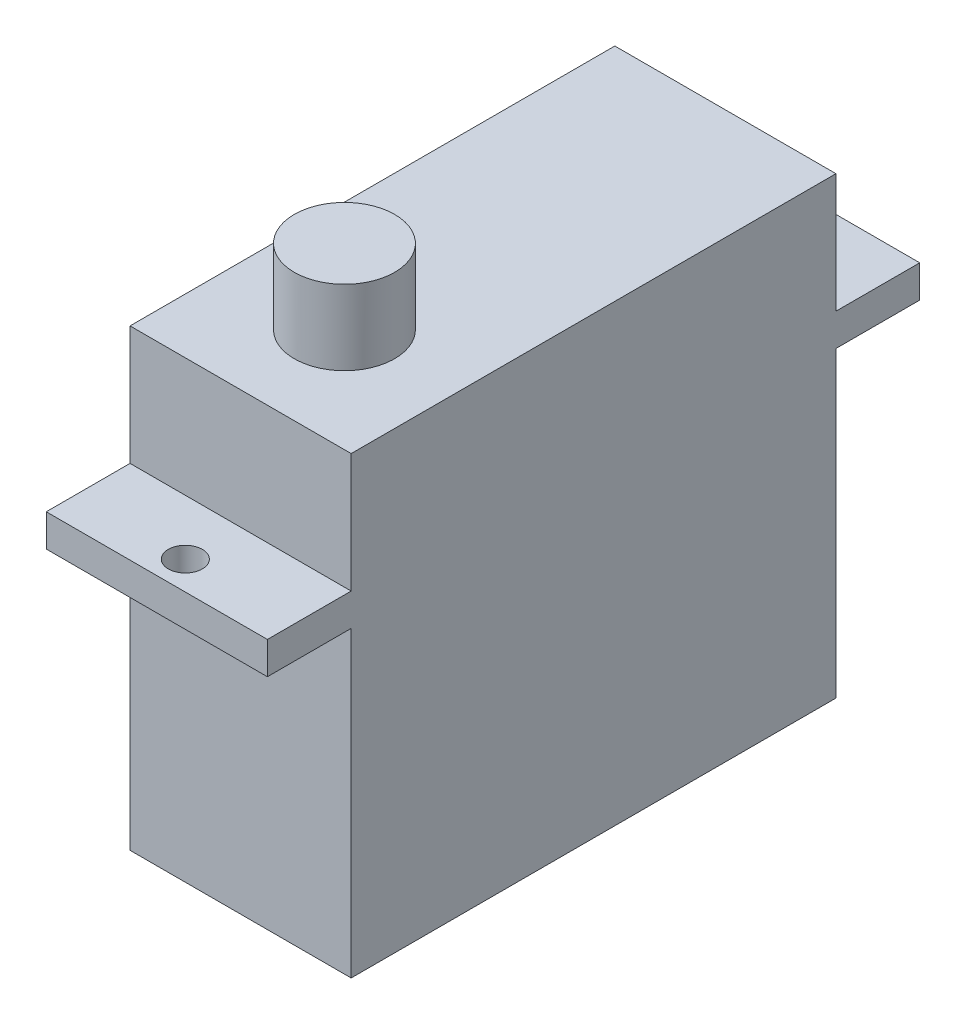
ISO-10303-21;
HEADER;
FILE_DESCRIPTION(('STEP AP214'),'2;1');
FILE_NAME('part.step','',(''),(''),'','','');
FILE_SCHEMA(('AUTOMOTIVE_DESIGN { 1 0 10303 214 1 1 1 1 }'));
ENDSEC;
DATA;
#1=APPLICATION_CONTEXT('core data for automotive mechanical design processes');
#2=APPLICATION_PROTOCOL_DEFINITION('international standard','automotive_design',2000,#1);
#3=PRODUCT_CONTEXT('',#1,'mechanical');
#4=PRODUCT('Part','Part','',(#3));
#5=PRODUCT_RELATED_PRODUCT_CATEGORY('part','',(#4));
#6=PRODUCT_DEFINITION_FORMATION('','',#4);
#7=PRODUCT_DEFINITION_CONTEXT('part definition',#1,'design');
#8=PRODUCT_DEFINITION('design','',#6,#7);
#9=PRODUCT_DEFINITION_SHAPE('','',#8);
#10=(LENGTH_UNIT() NAMED_UNIT(*) SI_UNIT(.MILLI.,.METRE.));
#11=(NAMED_UNIT(*) PLANE_ANGLE_UNIT() SI_UNIT($,.RADIAN.));
#12=(NAMED_UNIT(*) SI_UNIT($,.STERADIAN.) SOLID_ANGLE_UNIT());
#13=UNCERTAINTY_MEASURE_WITH_UNIT(LENGTH_MEASURE(1.E-05),#10,'distance_accuracy_value','');
#14=(GEOMETRIC_REPRESENTATION_CONTEXT(3) GLOBAL_UNCERTAINTY_ASSIGNED_CONTEXT((#13)) GLOBAL_UNIT_ASSIGNED_CONTEXT((#10,
#11,#12)) REPRESENTATION_CONTEXT('',''));
#15=CARTESIAN_POINT('',(0.,0.,0.));
#16=DIRECTION('',(0.,0.,1.));
#17=DIRECTION('',(1.,0.,0.));
#18=AXIS2_PLACEMENT_3D('',#15,#16,#17);
#19=CARTESIAN_POINT('',(13.,8.9,-14.25));
#20=DIRECTION('',(0.,0.,1.));
#21=DIRECTION('',(0.,-1.,0.));
#22=AXIS2_PLACEMENT_3D('',#19,#20,#21);
#23=PLANE('',#22);
#24=DIRECTION('',(0.,1.,0.));
#25=VECTOR('',#24,1.);
#26=CARTESIAN_POINT('',(0.,8.9,-14.25));
#27=LINE('',#26,#25);
#28=CARTESIAN_POINT('',(0.,-8.9,-14.25));
#29=VERTEX_POINT('',#28);
#30=CARTESIAN_POINT('',(0.,8.9,-14.25));
#31=VERTEX_POINT('',#30);
#32=EDGE_CURVE('E165',#29,#31,#27,.T.);
#33=ORIENTED_EDGE('',*,*,#32,.T.);
#34=DIRECTION('',(-1.,0.,0.));
#35=VECTOR('',#34,1.);
#36=CARTESIAN_POINT('',(13.,8.9,-14.25));
#37=LINE('',#36,#35);
#38=CARTESIAN_POINT('',(13.,8.9,-14.25));
#39=VERTEX_POINT('',#38);
#40=EDGE_CURVE('E48',#39,#31,#37,.T.);
#41=ORIENTED_EDGE('',*,*,#40,.F.);
#42=DIRECTION('',(0.,1.,0.));
#43=VECTOR('',#42,1.);
#44=CARTESIAN_POINT('',(13.,8.9,-14.25));
#45=LINE('',#44,#43);
#46=CARTESIAN_POINT('',(13.,-8.9,-14.25));
#47=VERTEX_POINT('',#46);
#48=EDGE_CURVE('E200',#47,#39,#45,.T.);
#49=ORIENTED_EDGE('',*,*,#48,.F.);
#50=DIRECTION('',(-1.,0.,0.));
#51=VECTOR('',#50,1.);
#52=CARTESIAN_POINT('',(13.,-8.9,-14.25));
#53=LINE('',#52,#51);
#54=EDGE_CURVE('E161',#47,#29,#53,.T.);
#55=ORIENTED_EDGE('',*,*,#54,.T.);
#56=EDGE_LOOP('',(#33,#41,#49,#55));
#57=FACE_BOUND('',#56,.T.);
#58=ADVANCED_FACE('F39',(#57),#23,.F.);
#59=CARTESIAN_POINT('',(13.,8.9,-14.25));
#60=DIRECTION('',(0.,1.,0.));
#61=DIRECTION('',(0.,0.,1.));
#62=AXIS2_PLACEMENT_3D('',#59,#60,#61);
#63=PLANE('',#62);
#64=CARTESIAN_POINT('',(6.5,8.9,-17.5));
#65=DIRECTION('',(0.,1.,0.));
#66=DIRECTION('',(0.,0.,1.));
#67=AXIS2_PLACEMENT_3D('',#64,#65,#66);
#68=CIRCLE('',#67,1.);
#69=CARTESIAN_POINT('',(6.5,8.9,-16.5));
#70=VERTEX_POINT('',#69);
#71=EDGE_CURVE('E170',#70,#70,#68,.T.);
#72=ORIENTED_EDGE('',*,*,#71,.T.);
#73=EDGE_LOOP('',(#72));
#74=FACE_BOUND('',#73,.T.);
#75=DIRECTION('',(0.,0.,-1.));
#76=VECTOR('',#75,1.);
#77=CARTESIAN_POINT('',(0.,8.9,-14.25));
#78=LINE('',#77,#76);
#79=CARTESIAN_POINT('',(0.,8.9,-19.175));
#80=VERTEX_POINT('',#79);
#81=EDGE_CURVE('E169',#31,#80,#78,.T.);
#82=ORIENTED_EDGE('',*,*,#81,.T.);
#83=DIRECTION('',(-1.,0.,0.));
#84=VECTOR('',#83,1.);
#85=CARTESIAN_POINT('',(13.,8.9,-19.175));
#86=LINE('',#85,#84);
#87=CARTESIAN_POINT('',(13.,8.9,-19.175));
#88=VERTEX_POINT('',#87);
#89=EDGE_CURVE('E231',#88,#80,#86,.T.);
#90=ORIENTED_EDGE('',*,*,#89,.F.);
#91=DIRECTION('',(0.,0.,-1.));
#92=VECTOR('',#91,1.);
#93=CARTESIAN_POINT('',(13.,8.9,-14.25));
#94=LINE('',#93,#92);
#95=EDGE_CURVE('E112',#39,#88,#94,.T.);
#96=ORIENTED_EDGE('',*,*,#95,.F.);
#97=ORIENTED_EDGE('',*,*,#40,.T.);
#98=EDGE_LOOP('',(#82,#90,#96,#97));
#99=FACE_BOUND('',#98,.T.);
#100=ADVANCED_FACE('F307',(#74,#99),#63,.F.);
#101=CARTESIAN_POINT('',(13.,10.8,-19.175));
#102=DIRECTION('',(0.,0.,1.));
#103=DIRECTION('',(1.,0.,0.));
#104=AXIS2_PLACEMENT_3D('',#101,#102,#103);
#105=PLANE('',#104);
#106=DIRECTION('',(0.,1.,0.));
#107=VECTOR('',#106,1.);
#108=CARTESIAN_POINT('',(0.,10.8,-19.175));
#109=LINE('',#108,#107);
#110=CARTESIAN_POINT('',(0.,10.8,-19.175));
#111=VERTEX_POINT('',#110);
#112=EDGE_CURVE('E173',#80,#111,#109,.T.);
#113=ORIENTED_EDGE('',*,*,#112,.T.);
#114=DIRECTION('',(-1.,0.,0.));
#115=VECTOR('',#114,1.);
#116=CARTESIAN_POINT('',(13.,10.8,-19.175));
#117=LINE('',#116,#115);
#118=CARTESIAN_POINT('',(13.,10.8,-19.175));
#119=VERTEX_POINT('',#118);
#120=EDGE_CURVE('E227',#119,#111,#117,.T.);
#121=ORIENTED_EDGE('',*,*,#120,.F.);
#122=DIRECTION('',(0.,1.,0.));
#123=VECTOR('',#122,1.);
#124=CARTESIAN_POINT('',(13.,10.8,-19.175));
#125=LINE('',#124,#123);
#126=EDGE_CURVE('E261',#88,#119,#125,.T.);
#127=ORIENTED_EDGE('',*,*,#126,.F.);
#128=ORIENTED_EDGE('',*,*,#89,.T.);
#129=EDGE_LOOP('',(#113,#121,#127,#128));
#130=FACE_BOUND('',#129,.T.);
#131=ADVANCED_FACE('F311',(#130),#105,.F.);
#132=CARTESIAN_POINT('',(13.,10.8,-14.25));
#133=DIRECTION('',(0.,-1.,0.));
#134=DIRECTION('',(0.,0.,-1.));
#135=AXIS2_PLACEMENT_3D('',#132,#133,#134);
#136=PLANE('',#135);
#137=CARTESIAN_POINT('',(6.5,10.8,-17.5));
#138=DIRECTION('',(0.,1.,0.));
#139=DIRECTION('',(0.,0.,1.));
#140=AXIS2_PLACEMENT_3D('',#137,#138,#139);
#141=CIRCLE('',#140,1.);
#142=CARTESIAN_POINT('',(6.5,10.8,-16.5));
#143=VERTEX_POINT('',#142);
#144=EDGE_CURVE('E239',#143,#143,#141,.T.);
#145=ORIENTED_EDGE('',*,*,#144,.F.);
#146=EDGE_LOOP('',(#145));
#147=FACE_BOUND('',#146,.T.);
#148=DIRECTION('',(0.,0.,1.));
#149=VECTOR('',#148,1.);
#150=CARTESIAN_POINT('',(0.,10.8,-14.25));
#151=LINE('',#150,#149);
#152=CARTESIAN_POINT('',(0.,10.8,-14.25));
#153=VERTEX_POINT('',#152);
#154=EDGE_CURVE('E176',#111,#153,#151,.T.);
#155=ORIENTED_EDGE('',*,*,#154,.T.);
#156=DIRECTION('',(-1.,0.,0.));
#157=VECTOR('',#156,1.);
#158=CARTESIAN_POINT('',(13.,10.8,-14.25));
#159=LINE('',#158,#157);
#160=CARTESIAN_POINT('',(13.,10.8,-14.25));
#161=VERTEX_POINT('',#160);
#162=EDGE_CURVE('E223',#161,#153,#159,.T.);
#163=ORIENTED_EDGE('',*,*,#162,.F.);
#164=DIRECTION('',(0.,0.,1.));
#165=VECTOR('',#164,1.);
#166=CARTESIAN_POINT('',(13.,10.8,-14.25));
#167=LINE('',#166,#165);
#168=EDGE_CURVE('E264',#119,#161,#167,.T.);
#169=ORIENTED_EDGE('',*,*,#168,.F.);
#170=ORIENTED_EDGE('',*,*,#120,.T.);
#171=EDGE_LOOP('',(#155,#163,#169,#170));
#172=FACE_BOUND('',#171,.T.);
#173=ADVANCED_FACE('F316',(#147,#172),#136,.F.);
#174=CARTESIAN_POINT('',(13.,17.8,-14.25));
#175=DIRECTION('',(0.,0.,1.));
#176=DIRECTION('',(1.,0.,0.));
#177=AXIS2_PLACEMENT_3D('',#174,#175,#176);
#178=PLANE('',#177);
#179=DIRECTION('',(0.,1.,0.));
#180=VECTOR('',#179,1.);
#181=CARTESIAN_POINT('',(0.,17.8,-14.25));
#182=LINE('',#181,#180);
#183=CARTESIAN_POINT('',(0.,17.8,-14.25));
#184=VERTEX_POINT('',#183);
#185=EDGE_CURVE('E179',#153,#184,#182,.T.);
#186=ORIENTED_EDGE('',*,*,#185,.T.);
#187=DIRECTION('',(-1.,0.,0.));
#188=VECTOR('',#187,1.);
#189=CARTESIAN_POINT('',(13.,17.8,-14.25));
#190=LINE('',#189,#188);
#191=CARTESIAN_POINT('',(13.,17.8,-14.25));
#192=VERTEX_POINT('',#191);
#193=EDGE_CURVE('E219',#192,#184,#190,.T.);
#194=ORIENTED_EDGE('',*,*,#193,.F.);
#195=DIRECTION('',(0.,1.,0.));
#196=VECTOR('',#195,1.);
#197=CARTESIAN_POINT('',(13.,17.8,-14.25));
#198=LINE('',#197,#196);
#199=EDGE_CURVE('E267',#161,#192,#198,.T.);
#200=ORIENTED_EDGE('',*,*,#199,.F.);
#201=ORIENTED_EDGE('',*,*,#162,.T.);
#202=EDGE_LOOP('',(#186,#194,#200,#201));
#203=FACE_BOUND('',#202,.T.);
#204=ADVANCED_FACE('F322',(#203),#178,.F.);
#205=CARTESIAN_POINT('',(13.,17.8,14.25));
#206=DIRECTION('',(0.,-1.,0.));
#207=DIRECTION('',(0.,0.,-1.));
#208=AXIS2_PLACEMENT_3D('',#205,#206,#207);
#209=PLANE('',#208);
#210=CARTESIAN_POINT('',(6.5,17.8,8.145));
#211=DIRECTION('',(0.,-1.,0.));
#212=DIRECTION('',(0.,0.,-1.));
#213=AXIS2_PLACEMENT_3D('',#210,#211,#212);
#214=CIRCLE('',#213,2.95);
#215=CARTESIAN_POINT('',(6.5,17.8,5.195));
#216=VERTEX_POINT('',#215);
#217=EDGE_CURVE('E11',#216,#216,#214,.F.);
#218=ORIENTED_EDGE('',*,*,#217,.F.);
#219=EDGE_LOOP('',(#218));
#220=FACE_BOUND('',#219,.T.);
#221=DIRECTION('',(0.,0.,1.));
#222=VECTOR('',#221,1.);
#223=CARTESIAN_POINT('',(0.,17.8,14.25));
#224=LINE('',#223,#222);
#225=CARTESIAN_POINT('',(0.,17.8,14.25));
#226=VERTEX_POINT('',#225);
#227=EDGE_CURVE('E182',#184,#226,#224,.T.);
#228=ORIENTED_EDGE('',*,*,#227,.T.);
#229=DIRECTION('',(-1.,0.,0.));
#230=VECTOR('',#229,1.);
#231=CARTESIAN_POINT('',(13.,17.8,14.25));
#232=LINE('',#231,#230);
#233=CARTESIAN_POINT('',(13.,17.8,14.25));
#234=VERTEX_POINT('',#233);
#235=EDGE_CURVE('E215',#234,#226,#232,.T.);
#236=ORIENTED_EDGE('',*,*,#235,.F.);
#237=DIRECTION('',(0.,0.,1.));
#238=VECTOR('',#237,1.);
#239=CARTESIAN_POINT('',(13.,17.8,14.25));
#240=LINE('',#239,#238);
#241=EDGE_CURVE('E270',#192,#234,#240,.T.);
#242=ORIENTED_EDGE('',*,*,#241,.F.);
#243=ORIENTED_EDGE('',*,*,#193,.T.);
#244=EDGE_LOOP('',(#228,#236,#242,#243));
#245=FACE_BOUND('',#244,.T.);
#246=ADVANCED_FACE('F326',(#220,#245),#209,.F.);
#247=CARTESIAN_POINT('',(13.,17.8,14.25));
#248=DIRECTION('',(0.,0.,-1.));
#249=DIRECTION('',(-1.,0.,0.));
#250=AXIS2_PLACEMENT_3D('',#247,#248,#249);
#251=PLANE('',#250);
#252=DIRECTION('',(0.,-1.,0.));
#253=VECTOR('',#252,1.);
#254=CARTESIAN_POINT('',(0.,17.8,14.25));
#255=LINE('',#254,#253);
#256=CARTESIAN_POINT('',(0.,10.8,14.25));
#257=VERTEX_POINT('',#256);
#258=EDGE_CURVE('E185',#226,#257,#255,.T.);
#259=ORIENTED_EDGE('',*,*,#258,.T.);
#260=DIRECTION('',(-1.,0.,0.));
#261=VECTOR('',#260,1.);
#262=CARTESIAN_POINT('',(13.,10.8,14.25));
#263=LINE('',#262,#261);
#264=CARTESIAN_POINT('',(13.,10.8,14.25));
#265=VERTEX_POINT('',#264);
#266=EDGE_CURVE('E211',#265,#257,#263,.T.);
#267=ORIENTED_EDGE('',*,*,#266,.F.);
#268=DIRECTION('',(0.,-1.,0.));
#269=VECTOR('',#268,1.);
#270=CARTESIAN_POINT('',(13.,17.8,14.25));
#271=LINE('',#270,#269);
#272=EDGE_CURVE('E273',#234,#265,#271,.T.);
#273=ORIENTED_EDGE('',*,*,#272,.F.);
#274=ORIENTED_EDGE('',*,*,#235,.T.);
#275=EDGE_LOOP('',(#259,#267,#273,#274));
#276=FACE_BOUND('',#275,.T.);
#277=ADVANCED_FACE('F330',(#276),#251,.F.);
#278=CARTESIAN_POINT('',(13.,10.8,19.175));
#279=DIRECTION('',(0.,-1.,0.));
#280=DIRECTION('',(0.,0.,-1.));
#281=AXIS2_PLACEMENT_3D('',#278,#279,#280);
#282=PLANE('',#281);
#283=CARTESIAN_POINT('',(6.5,10.8,17.5));
#284=DIRECTION('',(0.,1.,0.));
#285=DIRECTION('',(0.,0.,1.));
#286=AXIS2_PLACEMENT_3D('',#283,#284,#285);
#287=CIRCLE('',#286,1.);
#288=CARTESIAN_POINT('',(6.5,10.8,18.5));
#289=VERTEX_POINT('',#288);
#290=EDGE_CURVE('E247',#289,#289,#287,.T.);
#291=ORIENTED_EDGE('',*,*,#290,.F.);
#292=EDGE_LOOP('',(#291));
#293=FACE_BOUND('',#292,.T.);
#294=DIRECTION('',(0.,0.,1.));
#295=VECTOR('',#294,1.);
#296=CARTESIAN_POINT('',(0.,10.8,19.175));
#297=LINE('',#296,#295);
#298=CARTESIAN_POINT('',(0.,10.8,19.175));
#299=VERTEX_POINT('',#298);
#300=EDGE_CURVE('E188',#257,#299,#297,.T.);
#301=ORIENTED_EDGE('',*,*,#300,.T.);
#302=DIRECTION('',(-1.,0.,0.));
#303=VECTOR('',#302,1.);
#304=CARTESIAN_POINT('',(13.,10.8,19.175));
#305=LINE('',#304,#303);
#306=CARTESIAN_POINT('',(13.,10.8,19.175));
#307=VERTEX_POINT('',#306);
#308=EDGE_CURVE('E207',#307,#299,#305,.T.);
#309=ORIENTED_EDGE('',*,*,#308,.F.);
#310=DIRECTION('',(0.,0.,1.));
#311=VECTOR('',#310,1.);
#312=CARTESIAN_POINT('',(13.,10.8,19.175));
#313=LINE('',#312,#311);
#314=EDGE_CURVE('E276',#265,#307,#313,.T.);
#315=ORIENTED_EDGE('',*,*,#314,.F.);
#316=ORIENTED_EDGE('',*,*,#266,.T.);
#317=EDGE_LOOP('',(#301,#309,#315,#316));
#318=FACE_BOUND('',#317,.T.);
#319=ADVANCED_FACE('F284',(#293,#318),#282,.F.);
#320=CARTESIAN_POINT('',(13.,10.8,19.175));
#321=DIRECTION('',(0.,0.,-1.));
#322=DIRECTION('',(-1.,0.,0.));
#323=AXIS2_PLACEMENT_3D('',#320,#321,#322);
#324=PLANE('',#323);
#325=DIRECTION('',(0.,-1.,0.));
#326=VECTOR('',#325,1.);
#327=CARTESIAN_POINT('',(0.,10.8,19.175));
#328=LINE('',#327,#326);
#329=CARTESIAN_POINT('',(0.,8.9,19.175));
#330=VERTEX_POINT('',#329);
#331=EDGE_CURVE('E191',#299,#330,#328,.T.);
#332=ORIENTED_EDGE('',*,*,#331,.T.);
#333=DIRECTION('',(-1.,0.,0.));
#334=VECTOR('',#333,1.);
#335=CARTESIAN_POINT('',(13.,8.9,19.175));
#336=LINE('',#335,#334);
#337=CARTESIAN_POINT('',(13.,8.9,19.175));
#338=VERTEX_POINT('',#337);
#339=EDGE_CURVE('E154',#338,#330,#336,.T.);
#340=ORIENTED_EDGE('',*,*,#339,.F.);
#341=DIRECTION('',(0.,-1.,0.));
#342=VECTOR('',#341,1.);
#343=CARTESIAN_POINT('',(13.,10.8,19.175));
#344=LINE('',#343,#342);
#345=EDGE_CURVE('E143',#307,#338,#344,.T.);
#346=ORIENTED_EDGE('',*,*,#345,.F.);
#347=ORIENTED_EDGE('',*,*,#308,.T.);
#348=EDGE_LOOP('',(#332,#340,#346,#347));
#349=FACE_BOUND('',#348,.T.);
#350=ADVANCED_FACE('F288',(#349),#324,.F.);
#351=CARTESIAN_POINT('',(13.,8.9,19.175));
#352=DIRECTION('',(0.,1.,0.));
#353=DIRECTION('',(0.,0.,1.));
#354=AXIS2_PLACEMENT_3D('',#351,#352,#353);
#355=PLANE('',#354);
#356=CARTESIAN_POINT('',(6.5,8.9,17.5));
#357=DIRECTION('',(0.,1.,0.));
#358=DIRECTION('',(0.,0.,1.));
#359=AXIS2_PLACEMENT_3D('',#356,#357,#358);
#360=CIRCLE('',#359,1.);
#361=CARTESIAN_POINT('',(6.5,8.9,18.5));
#362=VERTEX_POINT('',#361);
#363=EDGE_CURVE('E236',#362,#362,#360,.T.);
#364=ORIENTED_EDGE('',*,*,#363,.T.);
#365=EDGE_LOOP('',(#364));
#366=FACE_BOUND('',#365,.T.);
#367=DIRECTION('',(0.,0.,-1.));
#368=VECTOR('',#367,1.);
#369=CARTESIAN_POINT('',(0.,8.9,19.175));
#370=LINE('',#369,#368);
#371=CARTESIAN_POINT('',(0.,8.9,14.25));
#372=VERTEX_POINT('',#371);
#373=EDGE_CURVE('E152',#330,#372,#370,.T.);
#374=ORIENTED_EDGE('',*,*,#373,.T.);
#375=DIRECTION('',(-1.,0.,0.));
#376=VECTOR('',#375,1.);
#377=CARTESIAN_POINT('',(13.,8.9,14.25));
#378=LINE('',#377,#376);
#379=CARTESIAN_POINT('',(13.,8.9,14.25));
#380=VERTEX_POINT('',#379);
#381=EDGE_CURVE('E149',#380,#372,#378,.T.);
#382=ORIENTED_EDGE('',*,*,#381,.F.);
#383=DIRECTION('',(0.,0.,-1.));
#384=VECTOR('',#383,1.);
#385=CARTESIAN_POINT('',(13.,8.9,19.175));
#386=LINE('',#385,#384);
#387=EDGE_CURVE('E137',#338,#380,#386,.T.);
#388=ORIENTED_EDGE('',*,*,#387,.F.);
#389=ORIENTED_EDGE('',*,*,#339,.T.);
#390=EDGE_LOOP('',(#374,#382,#388,#389));
#391=FACE_BOUND('',#390,.T.);
#392=ADVANCED_FACE('F150',(#366,#391),#355,.F.);
#393=CARTESIAN_POINT('',(13.,8.9,14.25));
#394=DIRECTION('',(0.,0.,-1.));
#395=DIRECTION('',(0.,1.,0.));
#396=AXIS2_PLACEMENT_3D('',#393,#394,#395);
#397=PLANE('',#396);
#398=DIRECTION('',(0.,-1.,0.));
#399=VECTOR('',#398,1.);
#400=CARTESIAN_POINT('',(0.,8.9,14.25));
#401=LINE('',#400,#399);
#402=CARTESIAN_POINT('',(0.,-8.9,14.25));
#403=VERTEX_POINT('',#402);
#404=EDGE_CURVE('E97',#372,#403,#401,.T.);
#405=ORIENTED_EDGE('',*,*,#404,.T.);
#406=DIRECTION('',(-1.,0.,0.));
#407=VECTOR('',#406,1.);
#408=CARTESIAN_POINT('',(13.,-8.9,14.25));
#409=LINE('',#408,#407);
#410=CARTESIAN_POINT('',(13.,-8.9,14.25));
#411=VERTEX_POINT('',#410);
#412=EDGE_CURVE('E155',#411,#403,#409,.T.);
#413=ORIENTED_EDGE('',*,*,#412,.F.);
#414=DIRECTION('',(0.,-1.,0.));
#415=VECTOR('',#414,1.);
#416=CARTESIAN_POINT('',(13.,8.9,14.25));
#417=LINE('',#416,#415);
#418=EDGE_CURVE('E141',#380,#411,#417,.T.);
#419=ORIENTED_EDGE('',*,*,#418,.F.);
#420=ORIENTED_EDGE('',*,*,#381,.T.);
#421=EDGE_LOOP('',(#405,#413,#419,#420));
#422=FACE_BOUND('',#421,.T.);
#423=ADVANCED_FACE('F157',(#422),#397,.F.);
#424=CARTESIAN_POINT('',(13.,-8.9,14.25));
#425=DIRECTION('',(0.,1.,0.));
#426=DIRECTION('',(0.,0.,1.));
#427=AXIS2_PLACEMENT_3D('',#424,#425,#426);
#428=PLANE('',#427);
#429=DIRECTION('',(0.,0.,-1.));
#430=VECTOR('',#429,1.);
#431=CARTESIAN_POINT('',(0.,-8.9,14.25));
#432=LINE('',#431,#430);
#433=EDGE_CURVE('E103',#403,#29,#432,.T.);
#434=ORIENTED_EDGE('',*,*,#433,.T.);
#435=ORIENTED_EDGE('',*,*,#54,.F.);
#436=DIRECTION('',(0.,0.,-1.));
#437=VECTOR('',#436,1.);
#438=CARTESIAN_POINT('',(13.,-8.9,14.25));
#439=LINE('',#438,#437);
#440=EDGE_CURVE('E56',#411,#47,#439,.T.);
#441=ORIENTED_EDGE('',*,*,#440,.F.);
#442=ORIENTED_EDGE('',*,*,#412,.T.);
#443=EDGE_LOOP('',(#434,#435,#441,#442));
#444=FACE_BOUND('',#443,.T.);
#445=ADVANCED_FACE('F296',(#444),#428,.F.);
#446=CARTESIAN_POINT('',(13.,0.,0.));
#447=DIRECTION('',(1.,0.,0.));
#448=DIRECTION('',(0.,0.,-1.));
#449=AXIS2_PLACEMENT_3D('',#446,#447,#448);
#450=PLANE('',#449);
#451=ORIENTED_EDGE('',*,*,#48,.T.);
#452=ORIENTED_EDGE('',*,*,#95,.T.);
#453=ORIENTED_EDGE('',*,*,#126,.T.);
#454=ORIENTED_EDGE('',*,*,#168,.T.);
#455=ORIENTED_EDGE('',*,*,#199,.T.);
#456=ORIENTED_EDGE('',*,*,#241,.T.);
#457=ORIENTED_EDGE('',*,*,#272,.T.);
#458=ORIENTED_EDGE('',*,*,#314,.T.);
#459=ORIENTED_EDGE('',*,*,#345,.T.);
#460=ORIENTED_EDGE('',*,*,#387,.T.);
#461=ORIENTED_EDGE('',*,*,#418,.T.);
#462=ORIENTED_EDGE('',*,*,#440,.T.);
#463=EDGE_LOOP('',(#451,#452,#453,#454,#455,#456,#457,#458,#459,#460,#461,#462));
#464=FACE_BOUND('',#463,.T.);
#465=ADVANCED_FACE('F139',(#464),#450,.T.);
#466=CARTESIAN_POINT('',(0.,0.,0.));
#467=DIRECTION('',(1.,0.,0.));
#468=DIRECTION('',(0.,0.,-1.));
#469=AXIS2_PLACEMENT_3D('',#466,#467,#468);
#470=PLANE('',#469);
#471=ORIENTED_EDGE('',*,*,#32,.F.);
#472=ORIENTED_EDGE('',*,*,#433,.F.);
#473=ORIENTED_EDGE('',*,*,#404,.F.);
#474=ORIENTED_EDGE('',*,*,#373,.F.);
#475=ORIENTED_EDGE('',*,*,#331,.F.);
#476=ORIENTED_EDGE('',*,*,#300,.F.);
#477=ORIENTED_EDGE('',*,*,#258,.F.);
#478=ORIENTED_EDGE('',*,*,#227,.F.);
#479=ORIENTED_EDGE('',*,*,#185,.F.);
#480=ORIENTED_EDGE('',*,*,#154,.F.);
#481=ORIENTED_EDGE('',*,*,#112,.F.);
#482=ORIENTED_EDGE('',*,*,#81,.F.);
#483=EDGE_LOOP('',(#471,#472,#473,#474,#475,#476,#477,#478,#479,#480,#481,#482));
#484=FACE_BOUND('',#483,.T.);
#485=ADVANCED_FACE('F291',(#484),#470,.F.);
#486=CARTESIAN_POINT('',(6.5,-8.9,17.5));
#487=DIRECTION('',(0.,1.,0.));
#488=DIRECTION('',(0.,0.,1.));
#489=AXIS2_PLACEMENT_3D('',#486,#487,#488);
#490=CYLINDRICAL_SURFACE('',#489,1.);
#491=ORIENTED_EDGE('',*,*,#290,.T.);
#492=EDGE_LOOP('',(#491));
#493=FACE_BOUND('',#492,.T.);
#494=ORIENTED_EDGE('',*,*,#363,.F.);
#495=EDGE_LOOP('',(#494));
#496=FACE_BOUND('',#495,.T.);
#497=ADVANCED_FACE('F372',(#493,#496),#490,.F.);
#498=CARTESIAN_POINT('',(6.5,-8.9,-17.5));
#499=DIRECTION('',(0.,1.,0.));
#500=DIRECTION('',(0.,0.,1.));
#501=AXIS2_PLACEMENT_3D('',#498,#499,#500);
#502=CYLINDRICAL_SURFACE('',#501,1.);
#503=ORIENTED_EDGE('',*,*,#144,.T.);
#504=EDGE_LOOP('',(#503));
#505=FACE_BOUND('',#504,.T.);
#506=ORIENTED_EDGE('',*,*,#71,.F.);
#507=EDGE_LOOP('',(#506));
#508=FACE_BOUND('',#507,.T.);
#509=ADVANCED_FACE('F422',(#505,#508),#502,.F.);
#510=CARTESIAN_POINT('',(6.5,22.2,8.145));
#511=DIRECTION('',(0.,-1.,0.));
#512=DIRECTION('',(0.,0.,-1.));
#513=AXIS2_PLACEMENT_3D('',#510,#511,#512);
#514=CYLINDRICAL_SURFACE('',#513,2.95);
#515=CARTESIAN_POINT('',(6.5,22.2,8.145));
#516=DIRECTION('',(0.,1.,0.));
#517=DIRECTION('',(0.,0.,1.));
#518=AXIS2_PLACEMENT_3D('',#515,#516,#517);
#519=CIRCLE('',#518,2.95);
#520=CARTESIAN_POINT('',(6.5,22.2,11.095));
#521=VERTEX_POINT('',#520);
#522=EDGE_CURVE('E253',#521,#521,#519,.T.);
#523=ORIENTED_EDGE('',*,*,#522,.F.);
#524=EDGE_LOOP('',(#523));
#525=FACE_BOUND('',#524,.T.);
#526=ORIENTED_EDGE('',*,*,#217,.T.);
#527=EDGE_LOOP('',(#526));
#528=FACE_BOUND('',#527,.T.);
#529=ADVANCED_FACE('F426',(#525,#528),#514,.T.);
#530=CARTESIAN_POINT('',(6.5,22.2,8.145));
#531=DIRECTION('',(0.,1.,0.));
#532=DIRECTION('',(0.,0.,1.));
#533=AXIS2_PLACEMENT_3D('',#530,#531,#532);
#534=PLANE('',#533);
#535=ORIENTED_EDGE('',*,*,#522,.T.);
#536=EDGE_LOOP('',(#535));
#537=FACE_BOUND('',#536,.T.);
#538=ADVANCED_FACE('F431',(#537),#534,.T.);
#539=CLOSED_SHELL('',(#58,#100,#131,#173,#204,#246,#277,#319,#350,#392,#423,#445,#465,#485,#497,
#509,#529,#538));
#540=MANIFOLD_SOLID_BREP('B2',#539);
#541=ADVANCED_BREP_SHAPE_REPRESENTATION('',(#18,#540),#14);
#542=SHAPE_DEFINITION_REPRESENTATION(#9,#541);
ENDSEC;
END-ISO-10303-21;
